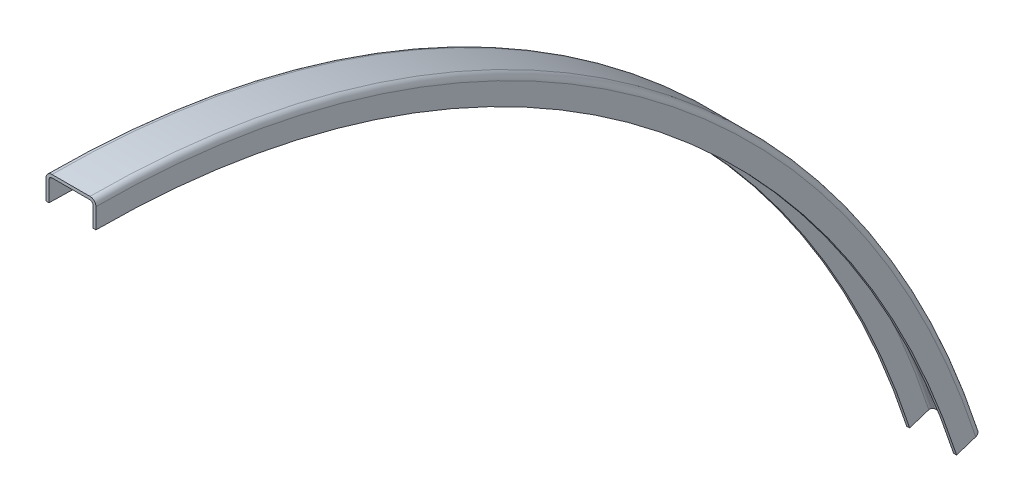
ISO-10303-21;
HEADER;
FILE_DESCRIPTION(('STEP AP214'),'2;1');
FILE_NAME('part.step','',(''),(''),'','','');
FILE_SCHEMA(('AUTOMOTIVE_DESIGN { 1 0 10303 214 1 1 1 1 }'));
ENDSEC;
DATA;
#1=APPLICATION_CONTEXT('core data for automotive mechanical design processes');
#2=APPLICATION_PROTOCOL_DEFINITION('international standard','automotive_design',2000,#1);
#3=PRODUCT_CONTEXT('',#1,'mechanical');
#4=PRODUCT('Part','Part','',(#3));
#5=PRODUCT_RELATED_PRODUCT_CATEGORY('part','',(#4));
#6=PRODUCT_DEFINITION_FORMATION('','',#4);
#7=PRODUCT_DEFINITION_CONTEXT('part definition',#1,'design');
#8=PRODUCT_DEFINITION('design','',#6,#7);
#9=PRODUCT_DEFINITION_SHAPE('','',#8);
#10=(LENGTH_UNIT() NAMED_UNIT(*) SI_UNIT(.MILLI.,.METRE.));
#11=(NAMED_UNIT(*) PLANE_ANGLE_UNIT() SI_UNIT($,.RADIAN.));
#12=(NAMED_UNIT(*) SI_UNIT($,.STERADIAN.) SOLID_ANGLE_UNIT());
#13=UNCERTAINTY_MEASURE_WITH_UNIT(LENGTH_MEASURE(1.E-05),#10,'distance_accuracy_value','');
#14=(GEOMETRIC_REPRESENTATION_CONTEXT(3) GLOBAL_UNCERTAINTY_ASSIGNED_CONTEXT((#13)) GLOBAL_UNIT_ASSIGNED_CONTEXT((#10,
#11,#12)) REPRESENTATION_CONTEXT('',''));
#15=CARTESIAN_POINT('',(0.,0.,0.));
#16=DIRECTION('',(0.,0.,1.));
#17=DIRECTION('',(1.,0.,0.));
#18=AXIS2_PLACEMENT_3D('',#15,#16,#17);
#19=CARTESIAN_POINT('',(-44.1574803149607,-1144.66929133858,0.));
#20=DIRECTION('',(1.,0.,0.));
#21=DIRECTION('',(0.,0.,-1.));
#22=AXIS2_PLACEMENT_3D('',#19,#20,#21);
#23=TOROIDAL_SURFACE('',#22,1242.,8.);
#24=CARTESIAN_POINT('',(-52.1574803149607,-1144.66929133858,0.));
#25=DIRECTION('',(1.,0.,0.));
#26=DIRECTION('',(0.,0.,-1.));
#27=AXIS2_PLACEMENT_3D('',#24,#25,#26);
#28=CIRCLE('',#27,1242.);
#29=CARTESIAN_POINT('',(-52.1574803149607,-760.870184324901,-1181.21219323858));
#30=VERTEX_POINT('',#29);
#31=CARTESIAN_POINT('',(-52.1574803149607,97.3307086614172,0.));
#32=VERTEX_POINT('',#31);
#33=EDGE_CURVE('E11',#30,#32,#28,.T.);
#34=ORIENTED_EDGE('',*,*,#33,.T.);
#35=CARTESIAN_POINT('',(-44.1574803149607,97.3307086614173,0.));
#36=DIRECTION('',(0.,0.,1.));
#37=DIRECTION('',(1.,0.,0.));
#38=AXIS2_PLACEMENT_3D('',#35,#36,#37);
#39=CIRCLE('',#38,8.);
#40=CARTESIAN_POINT('',(-44.1574803149606,105.330708661417,0.));
#41=VERTEX_POINT('',#40);
#42=EDGE_CURVE('E123',#32,#41,#39,.F.);
#43=ORIENTED_EDGE('',*,*,#42,.T.);
#44=CARTESIAN_POINT('',(-44.1574803149606,-1144.66929133858,0.));
#45=DIRECTION('',(1.,0.,0.));
#46=DIRECTION('',(0.,0.,-1.));
#47=AXIS2_PLACEMENT_3D('',#44,#45,#46);
#48=CIRCLE('',#47,1250.);
#49=CARTESIAN_POINT('',(-44.1574803149606,-758.398048369902,-1188.82064536894));
#50=VERTEX_POINT('',#49);
#51=EDGE_CURVE('E50',#50,#41,#48,.T.);
#52=ORIENTED_EDGE('',*,*,#51,.F.);
#53=CARTESIAN_POINT('',(-44.1574803149607,-760.870184324901,-1181.21219323858));
#54=DIRECTION('',(0.,0.951056516295154,0.309016994374945));
#55=DIRECTION('',(1.,0.,0.));
#56=AXIS2_PLACEMENT_3D('',#53,#54,#55);
#57=CIRCLE('',#56,8.);
#58=EDGE_CURVE('E125',#30,#50,#57,.F.);
#59=ORIENTED_EDGE('',*,*,#58,.F.);
#60=EDGE_LOOP('',(#34,#43,#52,#59));
#61=FACE_BOUND('',#60,.T.);
#62=ADVANCED_FACE('F35',(#61),#23,.T.);
#63=CARTESIAN_POINT('',(-52.1574803149607,-790.947027375836,-1088.64518853052));
#64=DIRECTION('',(-1.,0.,0.));
#65=DIRECTION('',(0.,0.,1.));
#66=AXIS2_PLACEMENT_3D('',#63,#64,#65);
#67=PLANE('',#66);
#68=CARTESIAN_POINT('',(-52.1574803149607,-1144.66929133858,0.));
#69=DIRECTION('',(1.,0.,0.));
#70=DIRECTION('',(0.,0.,-1.));
#71=AXIS2_PLACEMENT_3D('',#68,#69,#70);
#72=CIRCLE('',#71,1215.);
#73=CARTESIAN_POINT('',(-52.1574803149607,-769.213643173025,-1155.53366729861));
#74=VERTEX_POINT('',#73);
#75=CARTESIAN_POINT('',(-52.1574803149607,70.3307086614173,0.));
#76=VERTEX_POINT('',#75);
#77=EDGE_CURVE('E43',#74,#76,#72,.T.);
#78=ORIENTED_EDGE('',*,*,#77,.T.);
#79=DIRECTION('',(0.,-1.,0.));
#80=VECTOR('',#79,1.);
#81=CARTESIAN_POINT('',(-52.1574803149607,0.,0.));
#82=LINE('',#81,#80);
#83=EDGE_CURVE('E134',#32,#76,#82,.T.);
#84=ORIENTED_EDGE('',*,*,#83,.F.);
#85=ORIENTED_EDGE('',*,*,#33,.F.);
#86=DIRECTION('',(0.,-0.309016994374945,0.951056516295154));
#87=VECTOR('',#86,1.);
#88=CARTESIAN_POINT('',(-52.1574803149607,-790.947027375836,-1088.64518853052));
#89=LINE('',#88,#87);
#90=EDGE_CURVE('E168',#30,#74,#89,.T.);
#91=ORIENTED_EDGE('',*,*,#90,.T.);
#92=EDGE_LOOP('',(#78,#84,#85,#91));
#93=FACE_BOUND('',#92,.T.);
#94=ADVANCED_FACE('F37',(#93),#67,.T.);
#95=CARTESIAN_POINT('',(14.8425196850394,-1144.66929133858,0.));
#96=DIRECTION('',(1.,0.,0.));
#97=DIRECTION('',(0.,0.,-1.));
#98=AXIS2_PLACEMENT_3D('',#95,#96,#97);
#99=CYLINDRICAL_SURFACE('',#98,1215.);
#100=CARTESIAN_POINT('',(-48.1574803149607,-1144.66929133858,0.));
#101=DIRECTION('',(1.,0.,0.));
#102=DIRECTION('',(0.,0.,-1.));
#103=AXIS2_PLACEMENT_3D('',#100,#101,#102);
#104=CIRCLE('',#103,1215.);
#105=CARTESIAN_POINT('',(-48.1574803149607,-769.213643173025,-1155.53366729861));
#106=VERTEX_POINT('',#105);
#107=CARTESIAN_POINT('',(-48.1574803149607,70.3307086614173,0.));
#108=VERTEX_POINT('',#107);
#109=EDGE_CURVE('E214',#106,#108,#104,.T.);
#110=ORIENTED_EDGE('',*,*,#109,.T.);
#111=DIRECTION('',(1.,0.,0.));
#112=VECTOR('',#111,1.);
#113=CARTESIAN_POINT('',(0.,70.3307086614173,0.));
#114=LINE('',#113,#112);
#115=EDGE_CURVE('E139',#76,#108,#114,.T.);
#116=ORIENTED_EDGE('',*,*,#115,.F.);
#117=ORIENTED_EDGE('',*,*,#77,.F.);
#118=DIRECTION('',(1.,0.,0.));
#119=VECTOR('',#118,1.);
#120=CARTESIAN_POINT('',(0.,-769.213643173025,-1155.53366729861));
#121=LINE('',#120,#119);
#122=EDGE_CURVE('E170',#74,#106,#121,.T.);
#123=ORIENTED_EDGE('',*,*,#122,.T.);
#124=EDGE_LOOP('',(#110,#116,#117,#123));
#125=FACE_BOUND('',#124,.T.);
#126=ADVANCED_FACE('F216',(#125),#99,.F.);
#127=CARTESIAN_POINT('',(-48.1574803149607,-790.947027375836,-1088.64518853052));
#128=DIRECTION('',(1.,0.,0.));
#129=DIRECTION('',(0.,0.,-1.));
#130=AXIS2_PLACEMENT_3D('',#127,#128,#129);
#131=PLANE('',#130);
#132=CARTESIAN_POINT('',(-48.1574803149607,-1144.66929133858,0.));
#133=DIRECTION('',(1.,0.,0.));
#134=DIRECTION('',(0.,0.,-1.));
#135=AXIS2_PLACEMENT_3D('',#132,#133,#134);
#136=CIRCLE('',#135,1242.);
#137=CARTESIAN_POINT('',(-48.1574803149607,-760.870184324901,-1181.21219323858));
#138=VERTEX_POINT('',#137);
#139=CARTESIAN_POINT('',(-48.1574803149607,97.3307086614173,0.));
#140=VERTEX_POINT('',#139);
#141=EDGE_CURVE('E212',#138,#140,#136,.T.);
#142=ORIENTED_EDGE('',*,*,#141,.T.);
#143=DIRECTION('',(0.,1.,0.));
#144=VECTOR('',#143,1.);
#145=CARTESIAN_POINT('',(-48.1574803149607,0.,0.));
#146=LINE('',#145,#144);
#147=EDGE_CURVE('E141',#108,#140,#146,.T.);
#148=ORIENTED_EDGE('',*,*,#147,.F.);
#149=ORIENTED_EDGE('',*,*,#109,.F.);
#150=DIRECTION('',(0.,0.309016994374945,-0.951056516295154));
#151=VECTOR('',#150,1.);
#152=CARTESIAN_POINT('',(-48.1574803149607,-790.947027375836,-1088.64518853052));
#153=LINE('',#152,#151);
#154=EDGE_CURVE('E173',#106,#138,#153,.T.);
#155=ORIENTED_EDGE('',*,*,#154,.T.);
#156=EDGE_LOOP('',(#142,#148,#149,#155));
#157=FACE_BOUND('',#156,.T.);
#158=ADVANCED_FACE('F222',(#157),#131,.T.);
#159=CARTESIAN_POINT('',(-44.1574803149607,-1144.66929133858,0.));
#160=DIRECTION('',(1.,0.,0.));
#161=DIRECTION('',(0.,0.,-1.));
#162=AXIS2_PLACEMENT_3D('',#159,#160,#161);
#163=TOROIDAL_SURFACE('',#162,1242.,4.);
#164=CARTESIAN_POINT('',(-44.1574803149606,-1144.66929133858,0.));
#165=DIRECTION('',(1.,0.,0.));
#166=DIRECTION('',(0.,0.,-1.));
#167=AXIS2_PLACEMENT_3D('',#164,#165,#166);
#168=CIRCLE('',#167,1246.);
#169=CARTESIAN_POINT('',(-44.1574803149606,-759.634116347402,-1185.01641930376));
#170=VERTEX_POINT('',#169);
#171=CARTESIAN_POINT('',(-44.1574803149606,101.330708661417,0.));
#172=VERTEX_POINT('',#171);
#173=EDGE_CURVE('E210',#170,#172,#168,.T.);
#174=ORIENTED_EDGE('',*,*,#173,.T.);
#175=CARTESIAN_POINT('',(-44.1574803149607,97.3307086614173,0.));
#176=DIRECTION('',(0.,0.,1.));
#177=DIRECTION('',(1.,0.,0.));
#178=AXIS2_PLACEMENT_3D('',#175,#176,#177);
#179=CIRCLE('',#178,4.);
#180=EDGE_CURVE('E146',#140,#172,#179,.F.);
#181=ORIENTED_EDGE('',*,*,#180,.F.);
#182=ORIENTED_EDGE('',*,*,#141,.F.);
#183=CARTESIAN_POINT('',(-44.1574803149607,-760.870184324901,-1181.21219323858));
#184=DIRECTION('',(0.,0.951056516295154,0.309016994374945));
#185=DIRECTION('',(1.,0.,0.));
#186=AXIS2_PLACEMENT_3D('',#183,#184,#185);
#187=CIRCLE('',#186,4.);
#188=EDGE_CURVE('E176',#138,#170,#187,.F.);
#189=ORIENTED_EDGE('',*,*,#188,.T.);
#190=EDGE_LOOP('',(#174,#181,#182,#189));
#191=FACE_BOUND('',#190,.T.);
#192=ADVANCED_FACE('F225',(#191),#163,.F.);
#193=CARTESIAN_POINT('',(14.8425196850394,-1144.66929133858,0.));
#194=DIRECTION('',(1.,0.,0.));
#195=DIRECTION('',(0.,0.,-1.));
#196=AXIS2_PLACEMENT_3D('',#193,#194,#195);
#197=CYLINDRICAL_SURFACE('',#196,1246.);
#198=CARTESIAN_POINT('',(6.84251968503929,-1144.66929133858,0.));
#199=DIRECTION('',(1.,0.,0.));
#200=DIRECTION('',(0.,0.,-1.));
#201=AXIS2_PLACEMENT_3D('',#198,#199,#200);
#202=CIRCLE('',#201,1246.);
#203=CARTESIAN_POINT('',(6.84251968503929,-759.634116347402,-1185.01641930376));
#204=VERTEX_POINT('',#203);
#205=CARTESIAN_POINT('',(6.84251968503929,101.330708661417,0.));
#206=VERTEX_POINT('',#205);
#207=EDGE_CURVE('E208',#204,#206,#202,.T.);
#208=ORIENTED_EDGE('',*,*,#207,.T.);
#209=DIRECTION('',(1.,0.,0.));
#210=VECTOR('',#209,1.);
#211=CARTESIAN_POINT('',(0.,101.330708661417,0.));
#212=LINE('',#211,#210);
#213=EDGE_CURVE('E149',#172,#206,#212,.T.);
#214=ORIENTED_EDGE('',*,*,#213,.F.);
#215=ORIENTED_EDGE('',*,*,#173,.F.);
#216=DIRECTION('',(1.,0.,0.));
#217=VECTOR('',#216,1.);
#218=CARTESIAN_POINT('',(0.,-759.634116347402,-1185.01641930376));
#219=LINE('',#218,#217);
#220=EDGE_CURVE('E179',#170,#204,#219,.T.);
#221=ORIENTED_EDGE('',*,*,#220,.T.);
#222=EDGE_LOOP('',(#208,#214,#215,#221));
#223=FACE_BOUND('',#222,.T.);
#224=ADVANCED_FACE('F230',(#223),#197,.F.);
#225=CARTESIAN_POINT('',(6.84251968503932,-1144.66929133858,0.));
#226=DIRECTION('',(1.,0.,0.));
#227=DIRECTION('',(0.,0.,-1.));
#228=AXIS2_PLACEMENT_3D('',#225,#226,#227);
#229=TOROIDAL_SURFACE('',#228,1242.,4.);
#230=CARTESIAN_POINT('',(10.8425196850393,-1144.66929133858,0.));
#231=DIRECTION('',(1.,0.,0.));
#232=DIRECTION('',(0.,0.,-1.));
#233=AXIS2_PLACEMENT_3D('',#230,#231,#232);
#234=CIRCLE('',#233,1242.);
#235=CARTESIAN_POINT('',(10.8425196850393,-760.870184324901,-1181.21219323858));
#236=VERTEX_POINT('',#235);
#237=CARTESIAN_POINT('',(10.8425196850393,97.3307086614173,0.));
#238=VERTEX_POINT('',#237);
#239=EDGE_CURVE('E206',#236,#238,#234,.T.);
#240=ORIENTED_EDGE('',*,*,#239,.T.);
#241=CARTESIAN_POINT('',(6.84251968503932,97.3307086614173,0.));
#242=DIRECTION('',(0.,0.,1.));
#243=DIRECTION('',(1.,0.,0.));
#244=AXIS2_PLACEMENT_3D('',#241,#242,#243);
#245=CIRCLE('',#244,4.);
#246=EDGE_CURVE('E152',#238,#206,#245,.T.);
#247=ORIENTED_EDGE('',*,*,#246,.T.);
#248=ORIENTED_EDGE('',*,*,#207,.F.);
#249=CARTESIAN_POINT('',(6.84251968503932,-760.870184324901,-1181.21219323858));
#250=DIRECTION('',(0.,0.951056516295154,0.309016994374945));
#251=DIRECTION('',(1.,0.,0.));
#252=AXIS2_PLACEMENT_3D('',#249,#250,#251);
#253=CIRCLE('',#252,4.);
#254=EDGE_CURVE('E182',#236,#204,#253,.T.);
#255=ORIENTED_EDGE('',*,*,#254,.F.);
#256=EDGE_LOOP('',(#240,#247,#248,#255));
#257=FACE_BOUND('',#256,.T.);
#258=ADVANCED_FACE('F233',(#257),#229,.F.);
#259=CARTESIAN_POINT('',(10.8425196850393,-790.947027375836,-1088.64518853052));
#260=DIRECTION('',(-1.,0.,0.));
#261=DIRECTION('',(0.,0.,1.));
#262=AXIS2_PLACEMENT_3D('',#259,#260,#261);
#263=PLANE('',#262);
#264=CARTESIAN_POINT('',(10.8425196850393,-1144.66929133858,0.));
#265=DIRECTION('',(1.,0.,0.));
#266=DIRECTION('',(0.,0.,-1.));
#267=AXIS2_PLACEMENT_3D('',#264,#265,#266);
#268=CIRCLE('',#267,1215.);
#269=CARTESIAN_POINT('',(10.8425196850393,-769.213643173025,-1155.53366729861));
#270=VERTEX_POINT('',#269);
#271=CARTESIAN_POINT('',(10.8425196850393,70.3307086614173,0.));
#272=VERTEX_POINT('',#271);
#273=EDGE_CURVE('E204',#270,#272,#268,.T.);
#274=ORIENTED_EDGE('',*,*,#273,.T.);
#275=DIRECTION('',(0.,-1.,0.));
#276=VECTOR('',#275,1.);
#277=CARTESIAN_POINT('',(10.8425196850393,0.,0.));
#278=LINE('',#277,#276);
#279=EDGE_CURVE('E155',#238,#272,#278,.T.);
#280=ORIENTED_EDGE('',*,*,#279,.F.);
#281=ORIENTED_EDGE('',*,*,#239,.F.);
#282=DIRECTION('',(0.,-0.309016994374945,0.951056516295154));
#283=VECTOR('',#282,1.);
#284=CARTESIAN_POINT('',(10.8425196850393,-790.947027375836,-1088.64518853052));
#285=LINE('',#284,#283);
#286=EDGE_CURVE('E185',#236,#270,#285,.T.);
#287=ORIENTED_EDGE('',*,*,#286,.T.);
#288=EDGE_LOOP('',(#274,#280,#281,#287));
#289=FACE_BOUND('',#288,.T.);
#290=ADVANCED_FACE('F238',(#289),#263,.T.);
#291=CARTESIAN_POINT('',(14.8425196850394,-1144.66929133858,0.));
#292=DIRECTION('',(1.,0.,0.));
#293=DIRECTION('',(0.,0.,-1.));
#294=AXIS2_PLACEMENT_3D('',#291,#292,#293);
#295=CYLINDRICAL_SURFACE('',#294,1215.);
#296=CARTESIAN_POINT('',(14.8425196850393,-1144.66929133858,0.));
#297=DIRECTION('',(1.,0.,0.));
#298=DIRECTION('',(0.,0.,-1.));
#299=AXIS2_PLACEMENT_3D('',#296,#297,#298);
#300=CIRCLE('',#299,1215.);
#301=CARTESIAN_POINT('',(14.8425196850393,-769.213643173025,-1155.53366729861));
#302=VERTEX_POINT('',#301);
#303=CARTESIAN_POINT('',(14.8425196850393,70.3307086614173,0.));
#304=VERTEX_POINT('',#303);
#305=EDGE_CURVE('E202',#302,#304,#300,.T.);
#306=ORIENTED_EDGE('',*,*,#305,.T.);
#307=DIRECTION('',(1.,0.,0.));
#308=VECTOR('',#307,1.);
#309=CARTESIAN_POINT('',(0.,70.3307086614173,0.));
#310=LINE('',#309,#308);
#311=EDGE_CURVE('E158',#272,#304,#310,.T.);
#312=ORIENTED_EDGE('',*,*,#311,.F.);
#313=ORIENTED_EDGE('',*,*,#273,.F.);
#314=DIRECTION('',(1.,0.,0.));
#315=VECTOR('',#314,1.);
#316=CARTESIAN_POINT('',(0.,-769.213643173025,-1155.53366729861));
#317=LINE('',#316,#315);
#318=EDGE_CURVE('E188',#270,#302,#317,.T.);
#319=ORIENTED_EDGE('',*,*,#318,.T.);
#320=EDGE_LOOP('',(#306,#312,#313,#319));
#321=FACE_BOUND('',#320,.T.);
#322=ADVANCED_FACE('F241',(#321),#295,.F.);
#323=CARTESIAN_POINT('',(14.8425196850393,-790.947027375836,-1088.64518853052));
#324=DIRECTION('',(1.,0.,0.));
#325=DIRECTION('',(0.,0.,-1.));
#326=AXIS2_PLACEMENT_3D('',#323,#324,#325);
#327=PLANE('',#326);
#328=CARTESIAN_POINT('',(14.8425196850393,-1144.66929133858,0.));
#329=DIRECTION('',(1.,0.,0.));
#330=DIRECTION('',(0.,0.,-1.));
#331=AXIS2_PLACEMENT_3D('',#328,#329,#330);
#332=CIRCLE('',#331,1242.);
#333=CARTESIAN_POINT('',(14.8425196850393,-760.870184324901,-1181.21219323858));
#334=VERTEX_POINT('',#333);
#335=CARTESIAN_POINT('',(14.8425196850393,97.3307086614173,0.));
#336=VERTEX_POINT('',#335);
#337=EDGE_CURVE('E200',#334,#336,#332,.T.);
#338=ORIENTED_EDGE('',*,*,#337,.T.);
#339=DIRECTION('',(0.,1.,0.));
#340=VECTOR('',#339,1.);
#341=CARTESIAN_POINT('',(14.8425196850393,0.,0.));
#342=LINE('',#341,#340);
#343=EDGE_CURVE('E161',#304,#336,#342,.T.);
#344=ORIENTED_EDGE('',*,*,#343,.F.);
#345=ORIENTED_EDGE('',*,*,#305,.F.);
#346=DIRECTION('',(0.,0.309016994374945,-0.951056516295154));
#347=VECTOR('',#346,1.);
#348=CARTESIAN_POINT('',(14.8425196850393,-790.947027375836,-1088.64518853052));
#349=LINE('',#348,#347);
#350=EDGE_CURVE('E191',#302,#334,#349,.T.);
#351=ORIENTED_EDGE('',*,*,#350,.T.);
#352=EDGE_LOOP('',(#338,#344,#345,#351));
#353=FACE_BOUND('',#352,.T.);
#354=ADVANCED_FACE('F246',(#353),#327,.T.);
#355=CARTESIAN_POINT('',(6.84251968503932,-1144.66929133858,0.));
#356=DIRECTION('',(1.,0.,0.));
#357=DIRECTION('',(0.,0.,-1.));
#358=AXIS2_PLACEMENT_3D('',#355,#356,#357);
#359=TOROIDAL_SURFACE('',#358,1242.,8.);
#360=CARTESIAN_POINT('',(6.84251968503926,-1144.66929133858,0.));
#361=DIRECTION('',(1.,0.,0.));
#362=DIRECTION('',(0.,0.,-1.));
#363=AXIS2_PLACEMENT_3D('',#360,#361,#362);
#364=CIRCLE('',#363,1250.);
#365=CARTESIAN_POINT('',(6.84251968503926,-758.398048369902,-1188.82064536894));
#366=VERTEX_POINT('',#365);
#367=CARTESIAN_POINT('',(6.84251968503926,105.330708661417,0.));
#368=VERTEX_POINT('',#367);
#369=EDGE_CURVE('E58',#366,#368,#364,.T.);
#370=ORIENTED_EDGE('',*,*,#369,.T.);
#371=CARTESIAN_POINT('',(6.84251968503932,97.3307086614173,0.));
#372=DIRECTION('',(0.,0.,1.));
#373=DIRECTION('',(1.,0.,0.));
#374=AXIS2_PLACEMENT_3D('',#371,#372,#373);
#375=CIRCLE('',#374,8.);
#376=EDGE_CURVE('E164',#336,#368,#375,.T.);
#377=ORIENTED_EDGE('',*,*,#376,.F.);
#378=ORIENTED_EDGE('',*,*,#337,.F.);
#379=CARTESIAN_POINT('',(6.84251968503932,-760.870184324901,-1181.21219323858));
#380=DIRECTION('',(0.,0.951056516295154,0.309016994374945));
#381=DIRECTION('',(1.,0.,0.));
#382=AXIS2_PLACEMENT_3D('',#379,#380,#381);
#383=CIRCLE('',#382,8.);
#384=EDGE_CURVE('E194',#334,#366,#383,.T.);
#385=ORIENTED_EDGE('',*,*,#384,.T.);
#386=EDGE_LOOP('',(#370,#377,#378,#385));
#387=FACE_BOUND('',#386,.T.);
#388=ADVANCED_FACE('F249',(#387),#359,.T.);
#389=CARTESIAN_POINT('',(14.8425196850394,-1144.66929133858,0.));
#390=DIRECTION('',(1.,0.,0.));
#391=DIRECTION('',(0.,0.,-1.));
#392=AXIS2_PLACEMENT_3D('',#389,#390,#391);
#393=CYLINDRICAL_SURFACE('',#392,1250.);
#394=DIRECTION('',(-1.,0.,0.));
#395=VECTOR('',#394,1.);
#396=CARTESIAN_POINT('',(0.,-758.398048369902,-1188.82064536894));
#397=LINE('',#396,#395);
#398=EDGE_CURVE('E196',#366,#50,#397,.T.);
#399=ORIENTED_EDGE('',*,*,#398,.T.);
#400=ORIENTED_EDGE('',*,*,#51,.T.);
#401=DIRECTION('',(-1.,0.,0.));
#402=VECTOR('',#401,1.);
#403=CARTESIAN_POINT('',(0.,105.330708661417,0.));
#404=LINE('',#403,#402);
#405=EDGE_CURVE('E137',#368,#41,#404,.T.);
#406=ORIENTED_EDGE('',*,*,#405,.F.);
#407=ORIENTED_EDGE('',*,*,#369,.F.);
#408=EDGE_LOOP('',(#399,#400,#406,#407));
#409=FACE_BOUND('',#408,.T.);
#410=ADVANCED_FACE('F251',(#409),#393,.T.);
#411=CARTESIAN_POINT('',(0.,-790.947027375836,-1088.64518853052));
#412=DIRECTION('',(0.,0.951056516295154,0.309016994374945));
#413=DIRECTION('',(1.,0.,0.));
#414=AXIS2_PLACEMENT_3D('',#411,#412,#413);
#415=PLANE('',#414);
#416=ORIENTED_EDGE('',*,*,#58,.T.);
#417=ORIENTED_EDGE('',*,*,#398,.F.);
#418=ORIENTED_EDGE('',*,*,#384,.F.);
#419=ORIENTED_EDGE('',*,*,#350,.F.);
#420=ORIENTED_EDGE('',*,*,#318,.F.);
#421=ORIENTED_EDGE('',*,*,#286,.F.);
#422=ORIENTED_EDGE('',*,*,#254,.T.);
#423=ORIENTED_EDGE('',*,*,#220,.F.);
#424=ORIENTED_EDGE('',*,*,#188,.F.);
#425=ORIENTED_EDGE('',*,*,#154,.F.);
#426=ORIENTED_EDGE('',*,*,#122,.F.);
#427=ORIENTED_EDGE('',*,*,#90,.F.);
#428=EDGE_LOOP('',(#416,#417,#418,#419,#420,#421,#422,#423,#424,#425,#426,#427));
#429=FACE_BOUND('',#428,.T.);
#430=ADVANCED_FACE('F253',(#429),#415,.F.);
#431=CARTESIAN_POINT('',(0.,0.,0.));
#432=DIRECTION('',(0.,0.,1.));
#433=DIRECTION('',(1.,0.,0.));
#434=AXIS2_PLACEMENT_3D('',#431,#432,#433);
#435=PLANE('',#434);
#436=ORIENTED_EDGE('',*,*,#42,.F.);
#437=ORIENTED_EDGE('',*,*,#83,.T.);
#438=ORIENTED_EDGE('',*,*,#115,.T.);
#439=ORIENTED_EDGE('',*,*,#147,.T.);
#440=ORIENTED_EDGE('',*,*,#180,.T.);
#441=ORIENTED_EDGE('',*,*,#213,.T.);
#442=ORIENTED_EDGE('',*,*,#246,.F.);
#443=ORIENTED_EDGE('',*,*,#279,.T.);
#444=ORIENTED_EDGE('',*,*,#311,.T.);
#445=ORIENTED_EDGE('',*,*,#343,.T.);
#446=ORIENTED_EDGE('',*,*,#376,.T.);
#447=ORIENTED_EDGE('',*,*,#405,.T.);
#448=EDGE_LOOP('',(#436,#437,#438,#439,#440,#441,#442,#443,#444,#445,#446,#447));
#449=FACE_BOUND('',#448,.T.);
#450=ADVANCED_FACE('F132',(#449),#435,.T.);
#451=CLOSED_SHELL('',(#62,#94,#126,#158,#192,#224,#258,#290,#322,#354,#388,#410,#430,#450));
#452=MANIFOLD_SOLID_BREP('B2',#451);
#453=ADVANCED_BREP_SHAPE_REPRESENTATION('',(#18,#452),#14);
#454=SHAPE_DEFINITION_REPRESENTATION(#9,#453);
ENDSEC;
END-ISO-10303-21;
